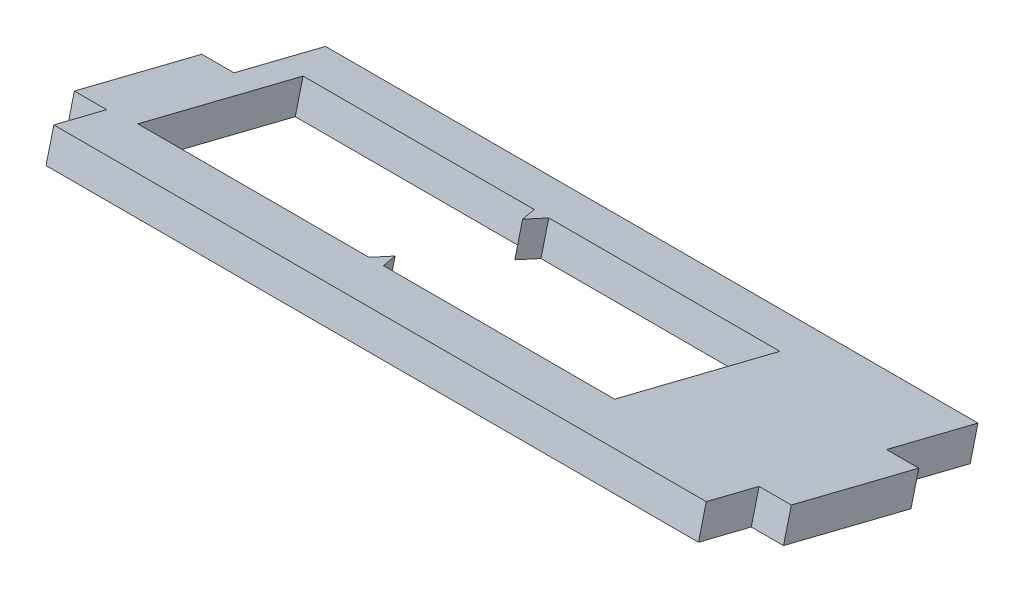
ISO-10303-21;
HEADER;
FILE_DESCRIPTION(('STEP AP214'),'2;1');
FILE_NAME('part.step','',(''),(''),'','','');
FILE_SCHEMA(('AUTOMOTIVE_DESIGN { 1 0 10303 214 1 1 1 1 }'));
ENDSEC;
DATA;
#1=APPLICATION_CONTEXT('core data for automotive mechanical design processes');
#2=APPLICATION_PROTOCOL_DEFINITION('international standard','automotive_design',2000,#1);
#3=PRODUCT_CONTEXT('',#1,'mechanical');
#4=PRODUCT('Part','Part','',(#3));
#5=PRODUCT_RELATED_PRODUCT_CATEGORY('part','',(#4));
#6=PRODUCT_DEFINITION_FORMATION('','',#4);
#7=PRODUCT_DEFINITION_CONTEXT('part definition',#1,'design');
#8=PRODUCT_DEFINITION('design','',#6,#7);
#9=PRODUCT_DEFINITION_SHAPE('','',#8);
#10=(LENGTH_UNIT() NAMED_UNIT(*) SI_UNIT(.MILLI.,.METRE.));
#11=(NAMED_UNIT(*) PLANE_ANGLE_UNIT() SI_UNIT($,.RADIAN.));
#12=(NAMED_UNIT(*) SI_UNIT($,.STERADIAN.) SOLID_ANGLE_UNIT());
#13=UNCERTAINTY_MEASURE_WITH_UNIT(LENGTH_MEASURE(1.E-05),#10,'distance_accuracy_value','');
#14=(GEOMETRIC_REPRESENTATION_CONTEXT(3) GLOBAL_UNCERTAINTY_ASSIGNED_CONTEXT((#13)) GLOBAL_UNIT_ASSIGNED_CONTEXT((#10,
#11,#12)) REPRESENTATION_CONTEXT('',''));
#15=CARTESIAN_POINT('',(0.,0.,0.));
#16=DIRECTION('',(0.,0.,1.));
#17=DIRECTION('',(1.,0.,0.));
#18=AXIS2_PLACEMENT_3D('',#15,#16,#17);
#19=CARTESIAN_POINT('',(9.6013052143908,0.,0.));
#20=DIRECTION('',(1.,0.,0.));
#21=DIRECTION('',(0.,0.,-1.));
#22=AXIS2_PLACEMENT_3D('',#19,#20,#21);
#23=PLANE('',#22);
#24=DIRECTION('',(0.,-0.242158788165578,-0.970236631608073));
#25=VECTOR('',#24,1.);
#26=CARTESIAN_POINT('',(9.6013052143908,70.7272554889128,76.0056442024922));
#27=LINE('',#26,#25);
#28=CARTESIAN_POINT('',(9.6013052143908,70.0036185817429,73.1063109152787));
#29=VERTEX_POINT('',#28);
#30=CARTESIAN_POINT('',(9.6013052143908,68.7775909853397,68.1940923895588));
#31=VERTEX_POINT('',#30);
#32=EDGE_CURVE('E11',#29,#31,#27,.T.);
#33=ORIENTED_EDGE('',*,*,#32,.F.);
#34=DIRECTION('',(0.,0.970236631608072,-0.242158788165579));
#35=VECTOR('',#34,1.);
#36=CARTESIAN_POINT('',(9.6013052143908,70.003618581743,73.1063109152787));
#37=LINE('',#36,#35);
#38=CARTESIAN_POINT('',(9.6013052143908,72.9143284765672,72.379834550782));
#39=VERTEX_POINT('',#38);
#40=EDGE_CURVE('E50',#29,#39,#37,.T.);
#41=ORIENTED_EDGE('',*,*,#40,.T.);
#42=DIRECTION('',(0.,-0.242158788165578,-0.970236631608072));
#43=VECTOR('',#42,1.);
#44=CARTESIAN_POINT('',(9.6013052143908,73.637965383737,75.2791678379955));
#45=LINE('',#44,#43);
#46=CARTESIAN_POINT('',(9.6013052143908,71.6883008801639,67.467616025062));
#47=VERTEX_POINT('',#46);
#48=EDGE_CURVE('E331',#39,#47,#45,.T.);
#49=ORIENTED_EDGE('',*,*,#48,.T.);
#50=DIRECTION('',(0.,0.970236631608072,-0.242158788165579));
#51=VECTOR('',#50,1.);
#52=CARTESIAN_POINT('',(9.6013052143908,68.7775909853397,68.1940923895588));
#53=LINE('',#52,#51);
#54=EDGE_CURVE('E249',#31,#47,#53,.T.);
#55=ORIENTED_EDGE('',*,*,#54,.F.);
#56=EDGE_LOOP('',(#33,#41,#49,#55));
#57=FACE_BOUND('',#56,.T.);
#58=ADVANCED_FACE('F32',(#57),#23,.F.);
#59=CARTESIAN_POINT('',(70.3013052143908,0.,0.));
#60=DIRECTION('',(1.,0.,0.));
#61=DIRECTION('',(0.,0.,-1.));
#62=AXIS2_PLACEMENT_3D('',#59,#60,#61);
#63=PLANE('',#62);
#64=DIRECTION('',(0.,0.970236631608072,-0.242158788165579));
#65=VECTOR('',#64,1.);
#66=CARTESIAN_POINT('',(70.3013052143908,70.003618581743,73.1063109152787));
#67=LINE('',#66,#65);
#68=CARTESIAN_POINT('',(70.3013052143908,70.003618581743,73.1063109152787));
#69=VERTEX_POINT('',#68);
#70=CARTESIAN_POINT('',(70.3013052143908,72.9143284765672,72.379834550782));
#71=VERTEX_POINT('',#70);
#72=EDGE_CURVE('E229',#69,#71,#67,.T.);
#73=ORIENTED_EDGE('',*,*,#72,.F.);
#74=DIRECTION('',(0.,-0.242158788165578,-0.970236631608073));
#75=VECTOR('',#74,1.);
#76=CARTESIAN_POINT('',(70.3013052143908,70.7272554889128,76.0056442024922));
#77=LINE('',#76,#75);
#78=CARTESIAN_POINT('',(70.3013052143908,68.7775909853397,68.1940923895588));
#79=VERTEX_POINT('',#78);
#80=EDGE_CURVE('E284',#69,#79,#77,.T.);
#81=ORIENTED_EDGE('',*,*,#80,.T.);
#82=DIRECTION('',(0.,0.970236631608072,-0.242158788165579));
#83=VECTOR('',#82,1.);
#84=CARTESIAN_POINT('',(70.3013052143908,68.7775909853397,68.1940923895588));
#85=LINE('',#84,#83);
#86=CARTESIAN_POINT('',(70.3013052143908,71.6883008801639,67.467616025062));
#87=VERTEX_POINT('',#86);
#88=EDGE_CURVE('E302',#79,#87,#85,.T.);
#89=ORIENTED_EDGE('',*,*,#88,.T.);
#90=DIRECTION('',(0.,-0.242158788165579,-0.970236631608073));
#91=VECTOR('',#90,1.);
#92=CARTESIAN_POINT('',(70.3013052143908,73.637965383737,75.2791678379955));
#93=LINE('',#92,#91);
#94=EDGE_CURVE('E36',#71,#87,#93,.T.);
#95=ORIENTED_EDGE('',*,*,#94,.F.);
#96=EDGE_LOOP('',(#73,#81,#89,#95));
#97=FACE_BOUND('',#96,.T.);
#98=ADVANCED_FACE('F398',(#97),#63,.T.);
#99=DIRECTION('',(0.,0.970236631608072,-0.242158788165579));
#100=VECTOR('',#99,1.);
#101=CARTESIAN_POINT('',(70.3013052143908,65.8178622033049,56.3356035620071));
#102=LINE('',#101,#100);
#103=CARTESIAN_POINT('',(70.3013052143908,65.8178622033049,56.3356035620071));
#104=VERTEX_POINT('',#103);
#105=CARTESIAN_POINT('',(70.3013052143908,68.7285720981291,55.6091271975103));
#106=VERTEX_POINT('',#105);
#107=EDGE_CURVE('E307',#104,#106,#102,.T.);
#108=ORIENTED_EDGE('',*,*,#107,.F.);
#109=CARTESIAN_POINT('',(70.3013052143908,63.6944534938427,47.8279258956192));
#110=VERTEX_POINT('',#109);
#111=EDGE_CURVE('E287',#104,#110,#77,.T.);
#112=ORIENTED_EDGE('',*,*,#111,.T.);
#113=DIRECTION('',(0.,0.970236631608072,-0.242158788165579));
#114=VECTOR('',#113,1.);
#115=CARTESIAN_POINT('',(70.3013052143908,63.6944534938427,47.8279258956192));
#116=LINE('',#115,#114);
#117=CARTESIAN_POINT('',(70.3013052143908,66.6051633886669,47.1014495311224));
#118=VERTEX_POINT('',#117);
#119=EDGE_CURVE('E237',#110,#118,#116,.T.);
#120=ORIENTED_EDGE('',*,*,#119,.T.);
#121=EDGE_CURVE('E292',#106,#118,#93,.T.);
#122=ORIENTED_EDGE('',*,*,#121,.F.);
#123=EDGE_LOOP('',(#108,#112,#120,#122));
#124=FACE_BOUND('',#123,.T.);
#125=ADVANCED_FACE('F34',(#124),#63,.T.);
#126=CARTESIAN_POINT('',(9.6013052143908,65.8178622033049,56.3356035620071));
#127=VERTEX_POINT('',#126);
#128=CARTESIAN_POINT('',(9.6013052143908,63.6944534938427,47.8279258956192));
#129=VERTEX_POINT('',#128);
#130=EDGE_CURVE('E42',#127,#129,#27,.T.);
#131=ORIENTED_EDGE('',*,*,#130,.F.);
#132=DIRECTION('',(0.,0.970236631608072,-0.242158788165579));
#133=VECTOR('',#132,1.);
#134=CARTESIAN_POINT('',(9.6013052143908,65.8178622033049,56.3356035620071));
#135=LINE('',#134,#133);
#136=CARTESIAN_POINT('',(9.6013052143908,68.728572098129,55.6091271975103));
#137=VERTEX_POINT('',#136);
#138=EDGE_CURVE('E260',#127,#137,#135,.T.);
#139=ORIENTED_EDGE('',*,*,#138,.T.);
#140=CARTESIAN_POINT('',(9.6013052143908,66.6051633886669,47.1014495311224));
#141=VERTEX_POINT('',#140);
#142=EDGE_CURVE('E286',#137,#141,#45,.T.);
#143=ORIENTED_EDGE('',*,*,#142,.T.);
#144=DIRECTION('',(0.,0.970236631608072,-0.242158788165579));
#145=VECTOR('',#144,1.);
#146=CARTESIAN_POINT('',(9.6013052143908,63.6944534938427,47.8279258956192));
#147=LINE('',#146,#145);
#148=EDGE_CURVE('E240',#129,#141,#147,.T.);
#149=ORIENTED_EDGE('',*,*,#148,.F.);
#150=EDGE_LOOP('',(#131,#139,#143,#149));
#151=FACE_BOUND('',#150,.T.);
#152=ADVANCED_FACE('F354',(#151),#23,.F.);
#153=CARTESIAN_POINT('',(100.153332064099,73.637965383737,75.2791678379955));
#154=DIRECTION('',(0.,0.970236631608072,-0.242158788165578));
#155=DIRECTION('',(0.,0.242158788165579,0.970236631608073));
#156=AXIS2_PLACEMENT_3D('',#153,#154,#155);
#157=PLANE('',#156);
#158=DIRECTION('',(0.351668624803608,0.226690787274696,0.908262332860676));
#159=VECTOR('',#158,1.);
#160=CARTESIAN_POINT('',(3.50464929949093,51.3140105794694,-14.1642873326404));
#161=LINE('',#160,#159);
#162=CARTESIAN_POINT('',(34.2713052143907,71.146651194063,65.2974351659026));
#163=VERTEX_POINT('',#162);
#164=CARTESIAN_POINT('',(34.9513052143906,71.5849892329849,67.0536862010644));
#165=VERTEX_POINT('',#164);
#166=EDGE_CURVE('E212',#163,#165,#161,.T.);
#167=ORIENTED_EDGE('',*,*,#166,.F.);
#168=DIRECTION('',(0.351668624803627,-0.226690787274694,-0.908262332860669));
#169=VECTOR('',#168,1.);
#170=CARTESIAN_POINT('',(56.5612401780706,56.7782300474796,7.7287272928886));
#171=LINE('',#170,#169);
#172=CARTESIAN_POINT('',(33.5913052143906,71.5849892329849,67.0536862010644));
#173=VERTEX_POINT('',#172);
#174=EDGE_CURVE('E214',#173,#163,#171,.T.);
#175=ORIENTED_EDGE('',*,*,#174,.F.);
#176=DIRECTION('',(1.,0.,0.));
#177=VECTOR('',#176,1.);
#178=CARTESIAN_POINT('',(12.0913052143906,71.5849892329849,67.0536862010644));
#179=LINE('',#178,#177);
#180=CARTESIAN_POINT('',(12.0913052143906,71.5849892329849,67.0536862010644));
#181=VERTEX_POINT('',#180);
#182=EDGE_CURVE('E644',#181,#173,#179,.T.);
#183=ORIENTED_EDGE('',*,*,#182,.F.);
#184=DIRECTION('',(0.,0.242158788165578,0.970236631608072));
#185=VECTOR('',#184,1.);
#186=CARTESIAN_POINT('',(12.0913052143906,67.7480751425752,51.6806550133494));
#187=LINE('',#186,#185);
#188=CARTESIAN_POINT('',(12.0913052143906,67.7480751425751,51.6806550133494));
#189=VERTEX_POINT('',#188);
#190=EDGE_CURVE('E638',#189,#181,#187,.T.);
#191=ORIENTED_EDGE('',*,*,#190,.F.);
#192=DIRECTION('',(-1.,0.,0.));
#193=VECTOR('',#192,1.);
#194=CARTESIAN_POINT('',(33.5913052143906,67.7480751425752,51.6806550133494));
#195=LINE('',#194,#193);
#196=CARTESIAN_POINT('',(33.5913052143906,67.7480751425752,51.6806550133494));
#197=VERTEX_POINT('',#196);
#198=EDGE_CURVE('E645',#197,#189,#195,.T.);
#199=ORIENTED_EDGE('',*,*,#198,.F.);
#200=DIRECTION('',(0.351668624803641,0.226690787274693,0.908262332860664));
#201=VECTOR('',#200,1.);
#202=CARTESIAN_POINT('',(7.5289799441223,50.9479155121131,-15.6310887140435));
#203=LINE('',#202,#201);
#204=CARTESIAN_POINT('',(34.2713052143907,68.1864131814971,53.436906048511));
#205=VERTEX_POINT('',#204);
#206=EDGE_CURVE('E221',#197,#205,#203,.T.);
#207=ORIENTED_EDGE('',*,*,#206,.T.);
#208=DIRECTION('',(0.351668624803618,-0.226690787274695,-0.908262332860673));
#209=VECTOR('',#208,1.);
#210=CARTESIAN_POINT('',(52.5369095334362,56.4121349801228,6.26192591148404));
#211=LINE('',#210,#209);
#212=CARTESIAN_POINT('',(34.9513052143906,67.7480751425752,51.6806550133494));
#213=VERTEX_POINT('',#212);
#214=EDGE_CURVE('E200',#205,#213,#211,.T.);
#215=ORIENTED_EDGE('',*,*,#214,.T.);
#216=DIRECTION('',(-1.,0.,0.));
#217=VECTOR('',#216,1.);
#218=CARTESIAN_POINT('',(56.4513052143907,67.7480751425752,51.6806550133494));
#219=LINE('',#218,#217);
#220=CARTESIAN_POINT('',(56.4513052143907,67.7480751425752,51.6806550133494));
#221=VERTEX_POINT('',#220);
#222=EDGE_CURVE('E375',#221,#213,#219,.T.);
#223=ORIENTED_EDGE('',*,*,#222,.F.);
#224=DIRECTION('',(0.,-0.242158788165578,-0.970236631608072));
#225=VECTOR('',#224,1.);
#226=CARTESIAN_POINT('',(56.4513052143907,71.5849892329849,67.0536862010644));
#227=LINE('',#226,#225);
#228=CARTESIAN_POINT('',(56.4513052143907,71.5849892329849,67.0536862010644));
#229=VERTEX_POINT('',#228);
#230=EDGE_CURVE('E670',#229,#221,#227,.T.);
#231=ORIENTED_EDGE('',*,*,#230,.F.);
#232=DIRECTION('',(1.,0.,0.));
#233=VECTOR('',#232,1.);
#234=CARTESIAN_POINT('',(34.9513052143906,71.5849892329849,67.0536862010644));
#235=LINE('',#234,#233);
#236=EDGE_CURVE('E377',#165,#229,#235,.T.);
#237=ORIENTED_EDGE('',*,*,#236,.F.);
#238=EDGE_LOOP('',(#167,#175,#183,#191,#199,#207,#215,#223,#231,#237));
#239=FACE_BOUND('',#238,.T.);
#240=DIRECTION('',(-1.,0.,0.));
#241=VECTOR('',#240,1.);
#242=CARTESIAN_POINT('',(70.3013052143908,72.9143284765672,72.379834550782));
#243=LINE('',#242,#241);
#244=EDGE_CURVE('E225',#71,#39,#243,.T.);
#245=ORIENTED_EDGE('',*,*,#244,.F.);
#246=ORIENTED_EDGE('',*,*,#94,.T.);
#247=DIRECTION('',(1.,0.,0.));
#248=VECTOR('',#247,1.);
#249=CARTESIAN_POINT('',(70.3013052143908,71.6883008801639,67.467616025062));
#250=LINE('',#249,#248);
#251=CARTESIAN_POINT('',(73.3013052143908,71.6883008801639,67.467616025062));
#252=VERTEX_POINT('',#251);
#253=EDGE_CURVE('E296',#87,#252,#250,.T.);
#254=ORIENTED_EDGE('',*,*,#253,.T.);
#255=DIRECTION('',(0.,-0.242158788165579,-0.970236631608072));
#256=VECTOR('',#255,1.);
#257=CARTESIAN_POINT('',(73.3013052143908,71.6883008801639,67.467616025062));
#258=LINE('',#257,#256);
#259=CARTESIAN_POINT('',(73.3013052143908,68.7285720981291,55.6091271975103));
#260=VERTEX_POINT('',#259);
#261=EDGE_CURVE('E299',#252,#260,#258,.T.);
#262=ORIENTED_EDGE('',*,*,#261,.T.);
#263=DIRECTION('',(-1.,0.,0.));
#264=VECTOR('',#263,1.);
#265=CARTESIAN_POINT('',(73.3013052143908,68.7285720981291,55.6091271975103));
#266=LINE('',#265,#264);
#267=EDGE_CURVE('E257',#260,#106,#266,.T.);
#268=ORIENTED_EDGE('',*,*,#267,.T.);
#269=ORIENTED_EDGE('',*,*,#121,.T.);
#270=DIRECTION('',(-1.,0.,0.));
#271=VECTOR('',#270,1.);
#272=CARTESIAN_POINT('',(9.6013052143908,66.6051633886669,47.1014495311224));
#273=LINE('',#272,#271);
#274=EDGE_CURVE('E233',#118,#141,#273,.T.);
#275=ORIENTED_EDGE('',*,*,#274,.T.);
#276=ORIENTED_EDGE('',*,*,#142,.F.);
#277=DIRECTION('',(-1.,0.,0.));
#278=VECTOR('',#277,1.);
#279=CARTESIAN_POINT('',(9.6013052143908,68.7285720981291,55.6091271975103));
#280=LINE('',#279,#278);
#281=CARTESIAN_POINT('',(6.6013052143908,68.7285720981291,55.6091271975103));
#282=VERTEX_POINT('',#281);
#283=EDGE_CURVE('E58',#137,#282,#280,.T.);
#284=ORIENTED_EDGE('',*,*,#283,.T.);
#285=DIRECTION('',(0.,0.242158788165579,0.970236631608072));
#286=VECTOR('',#285,1.);
#287=CARTESIAN_POINT('',(6.6013052143908,68.7285720981291,55.6091271975103));
#288=LINE('',#287,#286);
#289=CARTESIAN_POINT('',(6.6013052143908,71.6883008801639,67.467616025062));
#290=VERTEX_POINT('',#289);
#291=EDGE_CURVE('E251',#282,#290,#288,.T.);
#292=ORIENTED_EDGE('',*,*,#291,.T.);
#293=DIRECTION('',(1.,0.,0.));
#294=VECTOR('',#293,1.);
#295=CARTESIAN_POINT('',(6.6013052143908,71.6883008801639,67.467616025062));
#296=LINE('',#295,#294);
#297=EDGE_CURVE('E243',#290,#47,#296,.T.);
#298=ORIENTED_EDGE('',*,*,#297,.T.);
#299=ORIENTED_EDGE('',*,*,#48,.F.);
#300=EDGE_LOOP('',(#245,#246,#254,#262,#268,#269,#275,#276,#284,#292,#298,#299));
#301=FACE_BOUND('',#300,.T.);
#302=ADVANCED_FACE('F382',(#239,#301),#157,.T.);
#303=CARTESIAN_POINT('',(100.153332064099,70.7272554889128,76.0056442024922));
#304=DIRECTION('',(0.,0.970236631608073,-0.242158788165578));
#305=DIRECTION('',(0.,0.242158788165578,0.970236631608073));
#306=AXIS2_PLACEMENT_3D('',#303,#304,#305);
#307=PLANE('',#306);
#308=DIRECTION('',(0.351668624803627,-0.226690787274694,-0.908262332860669));
#309=VECTOR('',#308,1.);
#310=CARTESIAN_POINT('',(56.5612401780706,53.8675201526554,8.45520365738533));
#311=LINE('',#310,#309);
#312=CARTESIAN_POINT('',(33.5913052143906,68.6742793381607,67.7801625655611));
#313=VERTEX_POINT('',#312);
#314=CARTESIAN_POINT('',(34.2713052143907,68.2359412992388,66.0239115303994));
#315=VERTEX_POINT('',#314);
#316=EDGE_CURVE('E193',#313,#315,#311,.T.);
#317=ORIENTED_EDGE('',*,*,#316,.T.);
#318=DIRECTION('',(0.351668624803608,0.226690787274696,0.908262332860676));
#319=VECTOR('',#318,1.);
#320=CARTESIAN_POINT('',(3.50464929949093,48.4033006846452,-13.4378109681437));
#321=LINE('',#320,#319);
#322=CARTESIAN_POINT('',(34.9513052143906,68.6742793381607,67.7801625655611));
#323=VERTEX_POINT('',#322);
#324=EDGE_CURVE('E203',#315,#323,#321,.T.);
#325=ORIENTED_EDGE('',*,*,#324,.T.);
#326=DIRECTION('',(1.,0.,0.));
#327=VECTOR('',#326,1.);
#328=CARTESIAN_POINT('',(34.9513052143906,68.6742793381607,67.7801625655611));
#329=LINE('',#328,#327);
#330=CARTESIAN_POINT('',(56.4513052143907,68.6742793381607,67.7801625655611));
#331=VERTEX_POINT('',#330);
#332=EDGE_CURVE('E677',#323,#331,#329,.T.);
#333=ORIENTED_EDGE('',*,*,#332,.T.);
#334=DIRECTION('',(0.,-0.242158788165578,-0.970236631608072));
#335=VECTOR('',#334,1.);
#336=CARTESIAN_POINT('',(56.4513052143907,68.6742793381607,67.7801625655611));
#337=LINE('',#336,#335);
#338=CARTESIAN_POINT('',(56.4513052143907,64.837365247751,52.4071313778461));
#339=VERTEX_POINT('',#338);
#340=EDGE_CURVE('E676',#331,#339,#337,.T.);
#341=ORIENTED_EDGE('',*,*,#340,.T.);
#342=DIRECTION('',(-1.,0.,0.));
#343=VECTOR('',#342,1.);
#344=CARTESIAN_POINT('',(56.4513052143907,64.837365247751,52.4071313778461));
#345=LINE('',#344,#343);
#346=CARTESIAN_POINT('',(34.9513052143906,64.837365247751,52.4071313778461));
#347=VERTEX_POINT('',#346);
#348=EDGE_CURVE('E211',#339,#347,#345,.T.);
#349=ORIENTED_EDGE('',*,*,#348,.T.);
#350=DIRECTION('',(0.351668624803618,-0.226690787274695,-0.908262332860673));
#351=VECTOR('',#350,1.);
#352=CARTESIAN_POINT('',(52.5369095334362,53.5014250852986,6.98840227598078));
#353=LINE('',#352,#351);
#354=CARTESIAN_POINT('',(34.2713052143907,65.2757032866729,54.1633824130078));
#355=VERTEX_POINT('',#354);
#356=EDGE_CURVE('E194',#355,#347,#353,.T.);
#357=ORIENTED_EDGE('',*,*,#356,.F.);
#358=DIRECTION('',(0.351668624803641,0.226690787274693,0.908262332860664));
#359=VECTOR('',#358,1.);
#360=CARTESIAN_POINT('',(7.5289799441223,48.0372056172889,-14.9046123495467));
#361=LINE('',#360,#359);
#362=CARTESIAN_POINT('',(33.5913052143906,64.837365247751,52.4071313778461));
#363=VERTEX_POINT('',#362);
#364=EDGE_CURVE('E182',#363,#355,#361,.T.);
#365=ORIENTED_EDGE('',*,*,#364,.F.);
#366=DIRECTION('',(-1.,0.,0.));
#367=VECTOR('',#366,1.);
#368=CARTESIAN_POINT('',(33.5913052143906,64.837365247751,52.4071313778461));
#369=LINE('',#368,#367);
#370=CARTESIAN_POINT('',(12.0913052143906,64.837365247751,52.4071313778461));
#371=VERTEX_POINT('',#370);
#372=EDGE_CURVE('E651',#363,#371,#369,.T.);
#373=ORIENTED_EDGE('',*,*,#372,.T.);
#374=DIRECTION('',(0.,0.242158788165578,0.970236631608072));
#375=VECTOR('',#374,1.);
#376=CARTESIAN_POINT('',(12.0913052143906,64.837365247751,52.4071313778461));
#377=LINE('',#376,#375);
#378=CARTESIAN_POINT('',(12.0913052143906,68.6742793381607,67.7801625655611));
#379=VERTEX_POINT('',#378);
#380=EDGE_CURVE('E653',#371,#379,#377,.T.);
#381=ORIENTED_EDGE('',*,*,#380,.T.);
#382=DIRECTION('',(1.,0.,0.));
#383=VECTOR('',#382,1.);
#384=CARTESIAN_POINT('',(12.0913052143906,68.6742793381607,67.7801625655611));
#385=LINE('',#384,#383);
#386=EDGE_CURVE('E659',#379,#313,#385,.T.);
#387=ORIENTED_EDGE('',*,*,#386,.T.);
#388=EDGE_LOOP('',(#317,#325,#333,#341,#349,#357,#365,#373,#381,#387));
#389=FACE_BOUND('',#388,.T.);
#390=ORIENTED_EDGE('',*,*,#80,.F.);
#391=DIRECTION('',(-1.,0.,0.));
#392=VECTOR('',#391,1.);
#393=CARTESIAN_POINT('',(70.3013052143908,70.003618581743,73.1063109152787));
#394=LINE('',#393,#392);
#395=EDGE_CURVE('E227',#69,#29,#394,.T.);
#396=ORIENTED_EDGE('',*,*,#395,.T.);
#397=ORIENTED_EDGE('',*,*,#32,.T.);
#398=DIRECTION('',(1.,0.,0.));
#399=VECTOR('',#398,1.);
#400=CARTESIAN_POINT('',(6.6013052143908,68.7775909853397,68.1940923895588));
#401=LINE('',#400,#399);
#402=CARTESIAN_POINT('',(6.6013052143908,68.7775909853397,68.1940923895588));
#403=VERTEX_POINT('',#402);
#404=EDGE_CURVE('E254',#403,#31,#401,.T.);
#405=ORIENTED_EDGE('',*,*,#404,.F.);
#406=DIRECTION('',(0.,0.242158788165579,0.970236631608072));
#407=VECTOR('',#406,1.);
#408=CARTESIAN_POINT('',(6.6013052143908,65.8178622033049,56.3356035620071));
#409=LINE('',#408,#407);
#410=CARTESIAN_POINT('',(6.6013052143908,65.8178622033049,56.3356035620071));
#411=VERTEX_POINT('',#410);
#412=EDGE_CURVE('E246',#411,#403,#409,.T.);
#413=ORIENTED_EDGE('',*,*,#412,.F.);
#414=DIRECTION('',(-1.,0.,0.));
#415=VECTOR('',#414,1.);
#416=CARTESIAN_POINT('',(9.6013052143908,65.8178622033049,56.3356035620071));
#417=LINE('',#416,#415);
#418=EDGE_CURVE('E250',#127,#411,#417,.T.);
#419=ORIENTED_EDGE('',*,*,#418,.F.);
#420=ORIENTED_EDGE('',*,*,#130,.T.);
#421=DIRECTION('',(-1.,0.,0.));
#422=VECTOR('',#421,1.);
#423=CARTESIAN_POINT('',(9.6013052143908,63.6944534938427,47.8279258956192));
#424=LINE('',#423,#422);
#425=EDGE_CURVE('E234',#110,#129,#424,.T.);
#426=ORIENTED_EDGE('',*,*,#425,.F.);
#427=ORIENTED_EDGE('',*,*,#111,.F.);
#428=DIRECTION('',(-1.,0.,0.));
#429=VECTOR('',#428,1.);
#430=CARTESIAN_POINT('',(73.3013052143908,65.8178622033049,56.3356035620071));
#431=LINE('',#430,#429);
#432=CARTESIAN_POINT('',(73.3013052143908,65.8178622033049,56.3356035620071));
#433=VERTEX_POINT('',#432);
#434=EDGE_CURVE('E321',#433,#104,#431,.T.);
#435=ORIENTED_EDGE('',*,*,#434,.F.);
#436=DIRECTION('',(0.,-0.242158788165579,-0.970236631608072));
#437=VECTOR('',#436,1.);
#438=CARTESIAN_POINT('',(73.3013052143908,68.7775909853397,68.1940923895588));
#439=LINE('',#438,#437);
#440=CARTESIAN_POINT('',(73.3013052143908,68.7775909853397,68.1940923895588));
#441=VERTEX_POINT('',#440);
#442=EDGE_CURVE('E319',#441,#433,#439,.T.);
#443=ORIENTED_EDGE('',*,*,#442,.F.);
#444=DIRECTION('',(1.,0.,0.));
#445=VECTOR('',#444,1.);
#446=CARTESIAN_POINT('',(70.3013052143908,68.7775909853397,68.1940923895588));
#447=LINE('',#446,#445);
#448=EDGE_CURVE('E308',#79,#441,#447,.T.);
#449=ORIENTED_EDGE('',*,*,#448,.F.);
#450=EDGE_LOOP('',(#390,#396,#397,#405,#413,#419,#420,#426,#427,#435,#443,#449));
#451=FACE_BOUND('',#450,.T.);
#452=ADVANCED_FACE('F207',(#389,#451),#307,.F.);
#453=CARTESIAN_POINT('',(33.5913052143906,64.837365247751,52.4071313778461));
#454=DIRECTION('',(0.,-0.242158788165579,-0.970236631608072));
#455=DIRECTION('',(0.,0.970236631608073,-0.242158788165579));
#456=AXIS2_PLACEMENT_3D('',#453,#454,#455);
#457=PLANE('',#456);
#458=ORIENTED_EDGE('',*,*,#198,.T.);
#459=DIRECTION('',(0.,0.970236631608072,-0.242158788165579));
#460=VECTOR('',#459,1.);
#461=CARTESIAN_POINT('',(12.0913052143906,64.837365247751,52.4071313778461));
#462=LINE('',#461,#460);
#463=EDGE_CURVE('E334',#371,#189,#462,.T.);
#464=ORIENTED_EDGE('',*,*,#463,.F.);
#465=ORIENTED_EDGE('',*,*,#372,.F.);
#466=DIRECTION('',(0.,0.970236631608072,-0.242158788165579));
#467=VECTOR('',#466,1.);
#468=CARTESIAN_POINT('',(33.5913052143906,64.837365247751,52.4071313778461));
#469=LINE('',#468,#467);
#470=EDGE_CURVE('E188',#363,#197,#469,.T.);
#471=ORIENTED_EDGE('',*,*,#470,.T.);
#472=EDGE_LOOP('',(#458,#464,#465,#471));
#473=FACE_BOUND('',#472,.T.);
#474=ADVANCED_FACE('F474',(#473),#457,.F.);
#475=CARTESIAN_POINT('',(12.0913052143906,68.6742793381607,67.7801625655611));
#476=DIRECTION('',(0.,0.242158788165579,0.970236631608072));
#477=DIRECTION('',(0.,-0.970236631608073,0.242158788165579));
#478=AXIS2_PLACEMENT_3D('',#475,#476,#477);
#479=PLANE('',#478);
#480=ORIENTED_EDGE('',*,*,#182,.T.);
#481=DIRECTION('',(0.,0.970236631608072,-0.242158788165579));
#482=VECTOR('',#481,1.);
#483=CARTESIAN_POINT('',(33.5913052143906,68.6742793381607,67.7801625655611));
#484=LINE('',#483,#482);
#485=EDGE_CURVE('E658',#313,#173,#484,.T.);
#486=ORIENTED_EDGE('',*,*,#485,.F.);
#487=ORIENTED_EDGE('',*,*,#386,.F.);
#488=DIRECTION('',(0.,0.970236631608072,-0.242158788165579));
#489=VECTOR('',#488,1.);
#490=CARTESIAN_POINT('',(12.0913052143906,68.6742793381607,67.7801625655611));
#491=LINE('',#490,#489);
#492=EDGE_CURVE('E641',#379,#181,#491,.T.);
#493=ORIENTED_EDGE('',*,*,#492,.T.);
#494=EDGE_LOOP('',(#480,#486,#487,#493));
#495=FACE_BOUND('',#494,.T.);
#496=ADVANCED_FACE('F483',(#495),#479,.F.);
#497=CARTESIAN_POINT('',(12.0913052143906,64.837365247751,52.4071313778461));
#498=DIRECTION('',(-1.,0.,0.));
#499=DIRECTION('',(0.,0.,1.));
#500=AXIS2_PLACEMENT_3D('',#497,#498,#499);
#501=PLANE('',#500);
#502=ORIENTED_EDGE('',*,*,#190,.T.);
#503=ORIENTED_EDGE('',*,*,#492,.F.);
#504=ORIENTED_EDGE('',*,*,#380,.F.);
#505=ORIENTED_EDGE('',*,*,#463,.T.);
#506=EDGE_LOOP('',(#502,#503,#504,#505));
#507=FACE_BOUND('',#506,.T.);
#508=ADVANCED_FACE('F492',(#507),#501,.F.);
#509=CARTESIAN_POINT('',(56.4513052143907,64.837365247751,52.4071313778461));
#510=DIRECTION('',(0.,-0.242158788165579,-0.970236631608072));
#511=DIRECTION('',(0.,0.970236631608073,-0.242158788165579));
#512=AXIS2_PLACEMENT_3D('',#509,#510,#511);
#513=PLANE('',#512);
#514=ORIENTED_EDGE('',*,*,#222,.T.);
#515=DIRECTION('',(0.,0.970236631608072,-0.242158788165579));
#516=VECTOR('',#515,1.);
#517=CARTESIAN_POINT('',(34.9513052143906,64.837365247751,52.4071313778461));
#518=LINE('',#517,#516);
#519=EDGE_CURVE('E675',#347,#213,#518,.T.);
#520=ORIENTED_EDGE('',*,*,#519,.F.);
#521=ORIENTED_EDGE('',*,*,#348,.F.);
#522=DIRECTION('',(0.,0.970236631608072,-0.242158788165579));
#523=VECTOR('',#522,1.);
#524=CARTESIAN_POINT('',(56.4513052143907,64.837365247751,52.4071313778461));
#525=LINE('',#524,#523);
#526=EDGE_CURVE('E663',#339,#221,#525,.T.);
#527=ORIENTED_EDGE('',*,*,#526,.T.);
#528=EDGE_LOOP('',(#514,#520,#521,#527));
#529=FACE_BOUND('',#528,.T.);
#530=ADVANCED_FACE('F498',(#529),#513,.F.);
#531=CARTESIAN_POINT('',(56.4513052143907,68.6742793381607,67.7801625655611));
#532=DIRECTION('',(1.,0.,0.));
#533=DIRECTION('',(0.,0.,-1.));
#534=AXIS2_PLACEMENT_3D('',#531,#532,#533);
#535=PLANE('',#534);
#536=ORIENTED_EDGE('',*,*,#230,.T.);
#537=ORIENTED_EDGE('',*,*,#526,.F.);
#538=ORIENTED_EDGE('',*,*,#340,.F.);
#539=DIRECTION('',(0.,0.970236631608072,-0.242158788165579));
#540=VECTOR('',#539,1.);
#541=CARTESIAN_POINT('',(56.4513052143907,68.6742793381607,67.7801625655611));
#542=LINE('',#541,#540);
#543=EDGE_CURVE('E664',#331,#229,#542,.T.);
#544=ORIENTED_EDGE('',*,*,#543,.T.);
#545=EDGE_LOOP('',(#536,#537,#538,#544));
#546=FACE_BOUND('',#545,.T.);
#547=ADVANCED_FACE('F392',(#546),#535,.F.);
#548=CARTESIAN_POINT('',(34.9513052143906,68.6742793381607,67.7801625655611));
#549=DIRECTION('',(0.,0.242158788165579,0.970236631608072));
#550=DIRECTION('',(0.,-0.970236631608073,0.242158788165579));
#551=AXIS2_PLACEMENT_3D('',#548,#549,#550);
#552=PLANE('',#551);
#553=ORIENTED_EDGE('',*,*,#236,.T.);
#554=ORIENTED_EDGE('',*,*,#543,.F.);
#555=ORIENTED_EDGE('',*,*,#332,.F.);
#556=DIRECTION('',(0.,0.970236631608072,-0.242158788165579));
#557=VECTOR('',#556,1.);
#558=CARTESIAN_POINT('',(34.9513052143906,68.6742793381607,67.7801625655611));
#559=LINE('',#558,#557);
#560=EDGE_CURVE('E667',#323,#165,#559,.T.);
#561=ORIENTED_EDGE('',*,*,#560,.T.);
#562=EDGE_LOOP('',(#553,#554,#555,#561));
#563=FACE_BOUND('',#562,.T.);
#564=ADVANCED_FACE('F385',(#563),#552,.F.);
#565=CARTESIAN_POINT('',(73.3013052143908,65.8178622033049,56.3356035620071));
#566=DIRECTION('',(0.,-0.242158788165579,-0.970236631608072));
#567=DIRECTION('',(0.,0.970236631608073,-0.242158788165579));
#568=AXIS2_PLACEMENT_3D('',#565,#566,#567);
#569=PLANE('',#568);
#570=ORIENTED_EDGE('',*,*,#267,.F.);
#571=DIRECTION('',(0.,0.970236631608072,-0.242158788165579));
#572=VECTOR('',#571,1.);
#573=CARTESIAN_POINT('',(73.3013052143908,65.8178622033049,56.3356035620071));
#574=LINE('',#573,#572);
#575=EDGE_CURVE('E370',#433,#260,#574,.T.);
#576=ORIENTED_EDGE('',*,*,#575,.F.);
#577=ORIENTED_EDGE('',*,*,#434,.T.);
#578=ORIENTED_EDGE('',*,*,#107,.T.);
#579=EDGE_LOOP('',(#570,#576,#577,#578));
#580=FACE_BOUND('',#579,.T.);
#581=ADVANCED_FACE('F383',(#580),#569,.T.);
#582=CARTESIAN_POINT('',(73.3013052143908,68.7775909853397,68.1940923895588));
#583=DIRECTION('',(1.,0.,0.));
#584=DIRECTION('',(0.,0.,-1.));
#585=AXIS2_PLACEMENT_3D('',#582,#583,#584);
#586=PLANE('',#585);
#587=ORIENTED_EDGE('',*,*,#261,.F.);
#588=DIRECTION('',(0.,0.970236631608072,-0.242158788165579));
#589=VECTOR('',#588,1.);
#590=CARTESIAN_POINT('',(73.3013052143908,68.7775909853397,68.1940923895588));
#591=LINE('',#590,#589);
#592=EDGE_CURVE('E306',#441,#252,#591,.T.);
#593=ORIENTED_EDGE('',*,*,#592,.F.);
#594=ORIENTED_EDGE('',*,*,#442,.T.);
#595=ORIENTED_EDGE('',*,*,#575,.T.);
#596=EDGE_LOOP('',(#587,#593,#594,#595));
#597=FACE_BOUND('',#596,.T.);
#598=ADVANCED_FACE('F369',(#597),#586,.T.);
#599=CARTESIAN_POINT('',(70.3013052143908,68.7775909853397,68.1940923895588));
#600=DIRECTION('',(0.,0.242158788165579,0.970236631608072));
#601=DIRECTION('',(0.,-0.970236631608073,0.242158788165579));
#602=AXIS2_PLACEMENT_3D('',#599,#600,#601);
#603=PLANE('',#602);
#604=ORIENTED_EDGE('',*,*,#253,.F.);
#605=ORIENTED_EDGE('',*,*,#88,.F.);
#606=ORIENTED_EDGE('',*,*,#448,.T.);
#607=ORIENTED_EDGE('',*,*,#592,.T.);
#608=EDGE_LOOP('',(#604,#605,#606,#607));
#609=FACE_BOUND('',#608,.T.);
#610=ADVANCED_FACE('F380',(#609),#603,.T.);
#611=CARTESIAN_POINT('',(6.6013052143908,68.7775909853397,68.1940923895588));
#612=DIRECTION('',(0.,0.242158788165579,0.970236631608072));
#613=DIRECTION('',(0.,-0.970236631608073,0.242158788165579));
#614=AXIS2_PLACEMENT_3D('',#611,#612,#613);
#615=PLANE('',#614);
#616=ORIENTED_EDGE('',*,*,#297,.F.);
#617=DIRECTION('',(0.,0.970236631608072,-0.242158788165579));
#618=VECTOR('',#617,1.);
#619=CARTESIAN_POINT('',(6.6013052143908,68.7775909853397,68.1940923895588));
#620=LINE('',#619,#618);
#621=EDGE_CURVE('E255',#403,#290,#620,.T.);
#622=ORIENTED_EDGE('',*,*,#621,.F.);
#623=ORIENTED_EDGE('',*,*,#404,.T.);
#624=ORIENTED_EDGE('',*,*,#54,.T.);
#625=EDGE_LOOP('',(#616,#622,#623,#624));
#626=FACE_BOUND('',#625,.T.);
#627=ADVANCED_FACE('F450',(#626),#615,.T.);
#628=CARTESIAN_POINT('',(6.6013052143908,65.8178622033049,56.3356035620071));
#629=DIRECTION('',(-1.,0.,0.));
#630=DIRECTION('',(0.,0.,1.));
#631=AXIS2_PLACEMENT_3D('',#628,#629,#630);
#632=PLANE('',#631);
#633=ORIENTED_EDGE('',*,*,#291,.F.);
#634=DIRECTION('',(0.,0.970236631608072,-0.242158788165579));
#635=VECTOR('',#634,1.);
#636=CARTESIAN_POINT('',(6.6013052143908,65.8178622033049,56.3356035620071));
#637=LINE('',#636,#635);
#638=EDGE_CURVE('E258',#411,#282,#637,.T.);
#639=ORIENTED_EDGE('',*,*,#638,.F.);
#640=ORIENTED_EDGE('',*,*,#412,.T.);
#641=ORIENTED_EDGE('',*,*,#621,.T.);
#642=EDGE_LOOP('',(#633,#639,#640,#641));
#643=FACE_BOUND('',#642,.T.);
#644=ADVANCED_FACE('F441',(#643),#632,.T.);
#645=CARTESIAN_POINT('',(9.6013052143908,65.8178622033049,56.3356035620071));
#646=DIRECTION('',(0.,-0.242158788165579,-0.970236631608072));
#647=DIRECTION('',(0.,0.970236631608073,-0.242158788165579));
#648=AXIS2_PLACEMENT_3D('',#645,#646,#647);
#649=PLANE('',#648);
#650=ORIENTED_EDGE('',*,*,#283,.F.);
#651=ORIENTED_EDGE('',*,*,#138,.F.);
#652=ORIENTED_EDGE('',*,*,#418,.T.);
#653=ORIENTED_EDGE('',*,*,#638,.T.);
#654=EDGE_LOOP('',(#650,#651,#652,#653));
#655=FACE_BOUND('',#654,.T.);
#656=ADVANCED_FACE('F436',(#655),#649,.T.);
#657=CARTESIAN_POINT('',(9.6013052143908,63.6944534938427,47.8279258956192));
#658=DIRECTION('',(0.,-0.242158788165579,-0.970236631608072));
#659=DIRECTION('',(0.,0.970236631608073,-0.242158788165579));
#660=AXIS2_PLACEMENT_3D('',#657,#658,#659);
#661=PLANE('',#660);
#662=ORIENTED_EDGE('',*,*,#274,.F.);
#663=ORIENTED_EDGE('',*,*,#119,.F.);
#664=ORIENTED_EDGE('',*,*,#425,.T.);
#665=ORIENTED_EDGE('',*,*,#148,.T.);
#666=EDGE_LOOP('',(#662,#663,#664,#665));
#667=FACE_BOUND('',#666,.T.);
#668=ADVANCED_FACE('F359',(#667),#661,.T.);
#669=CARTESIAN_POINT('',(70.3013052143908,70.003618581743,73.1063109152787));
#670=DIRECTION('',(0.,-0.242158788165579,-0.970236631608072));
#671=DIRECTION('',(0.,0.970236631608073,-0.242158788165579));
#672=AXIS2_PLACEMENT_3D('',#669,#670,#671);
#673=PLANE('',#672);
#674=ORIENTED_EDGE('',*,*,#244,.T.);
#675=ORIENTED_EDGE('',*,*,#40,.F.);
#676=ORIENTED_EDGE('',*,*,#395,.F.);
#677=ORIENTED_EDGE('',*,*,#72,.T.);
#678=EDGE_LOOP('',(#674,#675,#676,#677));
#679=FACE_BOUND('',#678,.T.);
#680=ADVANCED_FACE('F514',(#679),#673,.F.);
#681=CARTESIAN_POINT('',(3.50464929949093,48.4033006846452,-13.4378109681437));
#682=DIRECTION('',(-0.936124552785974,0.0851596480182972,0.341201781971696));
#683=DIRECTION('',(0.342445778247621,0.,0.939537593159732));
#684=AXIS2_PLACEMENT_3D('',#681,#682,#683);
#685=PLANE('',#684);
#686=ORIENTED_EDGE('',*,*,#166,.T.);
#687=ORIENTED_EDGE('',*,*,#560,.F.);
#688=ORIENTED_EDGE('',*,*,#324,.F.);
#689=DIRECTION('',(0.,0.970236631608072,-0.242158788165579));
#690=VECTOR('',#689,1.);
#691=CARTESIAN_POINT('',(34.2713052143907,68.2359412992388,66.0239115303994));
#692=LINE('',#691,#690);
#693=EDGE_CURVE('E202',#315,#163,#692,.T.);
#694=ORIENTED_EDGE('',*,*,#693,.T.);
#695=EDGE_LOOP('',(#686,#687,#688,#694));
#696=FACE_BOUND('',#695,.T.);
#697=ADVANCED_FACE('F508',(#696),#685,.F.);
#698=CARTESIAN_POINT('',(56.5612401780706,53.8675201526554,8.45520365738533));
#699=DIRECTION('',(0.936124552785967,0.0851596480183018,0.341201781971714));
#700=DIRECTION('',(0.342445778247639,0.,-0.939537593159725));
#701=AXIS2_PLACEMENT_3D('',#698,#699,#700);
#702=PLANE('',#701);
#703=ORIENTED_EDGE('',*,*,#174,.T.);
#704=ORIENTED_EDGE('',*,*,#693,.F.);
#705=ORIENTED_EDGE('',*,*,#316,.F.);
#706=ORIENTED_EDGE('',*,*,#485,.T.);
#707=EDGE_LOOP('',(#703,#704,#705,#706));
#708=FACE_BOUND('',#707,.T.);
#709=ADVANCED_FACE('F513',(#708),#702,.F.);
#710=CARTESIAN_POINT('',(52.5369095334362,53.5014250852986,6.98840227598078));
#711=DIRECTION('',(0.93612455278597,0.0851596480182996,0.341201781971705));
#712=DIRECTION('',(0.34244577824763,0.,-0.939537593159728));
#713=AXIS2_PLACEMENT_3D('',#710,#711,#712);
#714=PLANE('',#713);
#715=ORIENTED_EDGE('',*,*,#214,.F.);
#716=DIRECTION('',(0.,0.970236631608072,-0.242158788165579));
#717=VECTOR('',#716,1.);
#718=CARTESIAN_POINT('',(34.2713052143907,65.2757032866729,54.1633824130078));
#719=LINE('',#718,#717);
#720=EDGE_CURVE('E185',#355,#205,#719,.T.);
#721=ORIENTED_EDGE('',*,*,#720,.F.);
#722=ORIENTED_EDGE('',*,*,#356,.T.);
#723=ORIENTED_EDGE('',*,*,#519,.T.);
#724=EDGE_LOOP('',(#715,#721,#722,#723));
#725=FACE_BOUND('',#724,.T.);
#726=ADVANCED_FACE('F197',(#725),#714,.T.);
#727=CARTESIAN_POINT('',(7.5289799441223,48.0372056172889,-14.9046123495467));
#728=DIRECTION('',(-0.936124552785961,0.0851596480183053,0.341201781971728));
#729=DIRECTION('',(0.342445778247653,0.,0.93953759315972));
#730=AXIS2_PLACEMENT_3D('',#727,#728,#729);
#731=PLANE('',#730);
#732=ORIENTED_EDGE('',*,*,#206,.F.);
#733=ORIENTED_EDGE('',*,*,#470,.F.);
#734=ORIENTED_EDGE('',*,*,#364,.T.);
#735=ORIENTED_EDGE('',*,*,#720,.T.);
#736=EDGE_LOOP('',(#732,#733,#734,#735));
#737=FACE_BOUND('',#736,.T.);
#738=ADVANCED_FACE('F184',(#737),#731,.T.);
#739=CLOSED_SHELL('',(#58,#98,#125,#152,#302,#452,#474,#496,#508,#530,#547,#564,#581,#598,#610,
#627,#644,#656,#668,#680,#697,#709,#726,#738));
#740=MANIFOLD_SOLID_BREP('B2',#739);
#741=ADVANCED_BREP_SHAPE_REPRESENTATION('',(#18,#740),#14);
#742=SHAPE_DEFINITION_REPRESENTATION(#9,#741);
ENDSEC;
END-ISO-10303-21;
